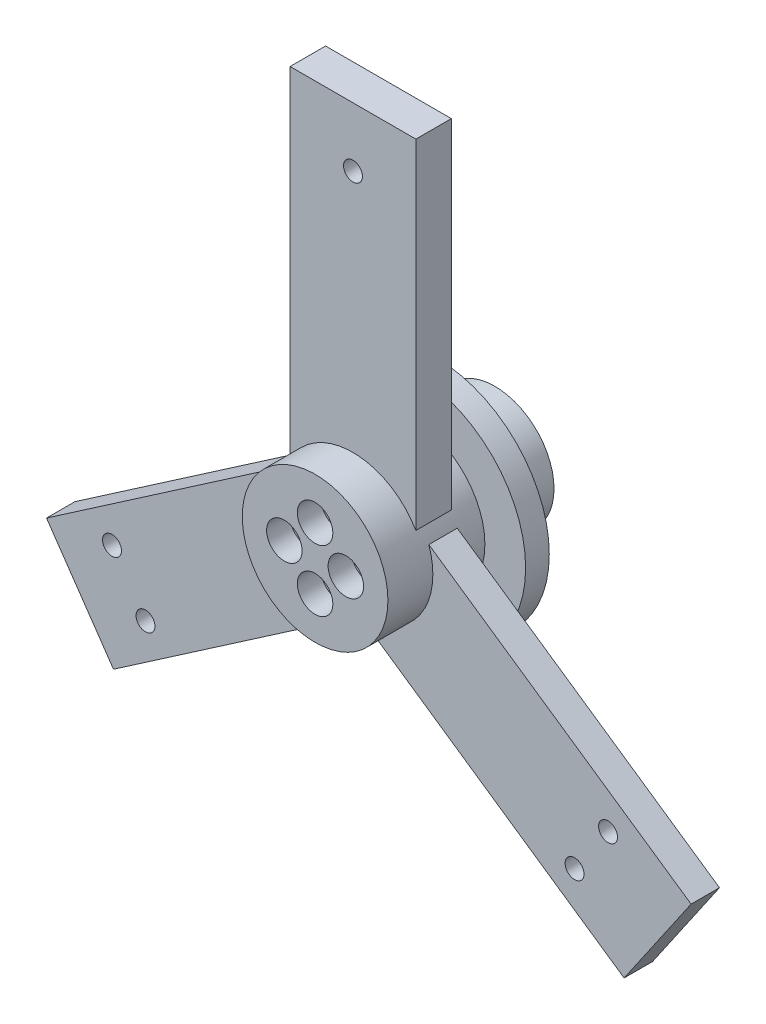
ISO-10303-21;
HEADER;
FILE_DESCRIPTION(('STEP AP214'),'2;1');
FILE_NAME('part.step','',(''),(''),'','','');
FILE_SCHEMA(('AUTOMOTIVE_DESIGN { 1 0 10303 214 1 1 1 1 }'));
ENDSEC;
DATA;
#1=APPLICATION_CONTEXT('core data for automotive mechanical design processes');
#2=APPLICATION_PROTOCOL_DEFINITION('international standard','automotive_design',2000,#1);
#3=PRODUCT_CONTEXT('',#1,'mechanical');
#4=PRODUCT('Part','Part','',(#3));
#5=PRODUCT_RELATED_PRODUCT_CATEGORY('part','',(#4));
#6=PRODUCT_DEFINITION_FORMATION('','',#4);
#7=PRODUCT_DEFINITION_CONTEXT('part definition',#1,'design');
#8=PRODUCT_DEFINITION('design','',#6,#7);
#9=PRODUCT_DEFINITION_SHAPE('','',#8);
#10=(LENGTH_UNIT() NAMED_UNIT(*) SI_UNIT(.MILLI.,.METRE.));
#11=(NAMED_UNIT(*) PLANE_ANGLE_UNIT() SI_UNIT($,.RADIAN.));
#12=(NAMED_UNIT(*) SI_UNIT($,.STERADIAN.) SOLID_ANGLE_UNIT());
#13=UNCERTAINTY_MEASURE_WITH_UNIT(LENGTH_MEASURE(1.E-05),#10,'distance_accuracy_value','');
#14=(GEOMETRIC_REPRESENTATION_CONTEXT(3) GLOBAL_UNCERTAINTY_ASSIGNED_CONTEXT((#13)) GLOBAL_UNIT_ASSIGNED_CONTEXT((#10,
#11,#12)) REPRESENTATION_CONTEXT('',''));
#15=CARTESIAN_POINT('',(0.,0.,0.));
#16=DIRECTION('',(0.,0.,1.));
#17=DIRECTION('',(1.,0.,0.));
#18=AXIS2_PLACEMENT_3D('',#15,#16,#17);
#19=CARTESIAN_POINT('',(0.,0.,25.));
#20=DIRECTION('',(0.,0.,-1.));
#21=DIRECTION('',(-1.,0.,0.));
#22=AXIS2_PLACEMENT_3D('',#19,#20,#21);
#23=CYLINDRICAL_SURFACE('',#22,25.);
#24=CARTESIAN_POINT('',(0.,0.,25.));
#25=DIRECTION('',(0.,0.,1.));
#26=DIRECTION('',(1.,0.,0.));
#27=AXIS2_PLACEMENT_3D('',#24,#25,#26);
#28=CIRCLE('',#27,25.);
#29=CARTESIAN_POINT('',(25.,0.,25.));
#30=VERTEX_POINT('',#29);
#31=EDGE_CURVE('E250',#30,#30,#28,.T.);
#32=ORIENTED_EDGE('',*,*,#31,.F.);
#33=EDGE_LOOP('',(#32));
#34=FACE_BOUND('',#33,.T.);
#35=CARTESIAN_POINT('',(0.,0.,0.));
#36=DIRECTION('',(0.,0.,1.));
#37=DIRECTION('',(1.,0.,0.));
#38=AXIS2_PLACEMENT_3D('',#35,#36,#37);
#39=CIRCLE('',#38,25.);
#40=CARTESIAN_POINT('',(25.,0.,0.));
#41=VERTEX_POINT('',#40);
#42=EDGE_CURVE('E255',#41,#41,#39,.T.);
#43=ORIENTED_EDGE('',*,*,#42,.T.);
#44=EDGE_LOOP('',(#43));
#45=FACE_BOUND('',#44,.T.);
#46=ADVANCED_FACE('F46',(#34,#45),#23,.T.);
#47=CARTESIAN_POINT('',(0.,0.,0.));
#48=DIRECTION('',(0.,0.,1.));
#49=DIRECTION('',(1.,0.,0.));
#50=AXIS2_PLACEMENT_3D('',#47,#48,#49);
#51=PLANE('',#50);
#52=CARTESIAN_POINT('',(0.,0.,0.));
#53=DIRECTION('',(0.,0.,-1.));
#54=DIRECTION('',(-1.,0.,0.));
#55=AXIS2_PLACEMENT_3D('',#52,#53,#54);
#56=CIRCLE('',#55,3.);
#57=CARTESIAN_POINT('',(-3.,0.,0.));
#58=VERTEX_POINT('',#57);
#59=EDGE_CURVE('E172',#58,#58,#56,.T.);
#60=ORIENTED_EDGE('',*,*,#59,.F.);
#61=EDGE_LOOP('',(#60));
#62=FACE_BOUND('',#61,.T.);
#63=ORIENTED_EDGE('',*,*,#42,.F.);
#64=EDGE_LOOP('',(#63));
#65=FACE_BOUND('',#64,.T.);
#66=ADVANCED_FACE('F324',(#62,#65),#51,.F.);
#67=CARTESIAN_POINT('',(0.,0.,35.));
#68=DIRECTION('',(0.,0.,-1.));
#69=DIRECTION('',(-1.,0.,0.));
#70=AXIS2_PLACEMENT_3D('',#67,#68,#69);
#71=CYLINDRICAL_SURFACE('',#70,48.);
#72=CARTESIAN_POINT('',(0.,0.,35.));
#73=DIRECTION('',(0.,0.,1.));
#74=DIRECTION('',(1.,0.,0.));
#75=AXIS2_PLACEMENT_3D('',#72,#73,#74);
#76=CIRCLE('',#75,48.);
#77=CARTESIAN_POINT('',(48.,0.,35.));
#78=VERTEX_POINT('',#77);
#79=EDGE_CURVE('E251',#78,#78,#76,.T.);
#80=ORIENTED_EDGE('',*,*,#79,.F.);
#81=EDGE_LOOP('',(#80));
#82=FACE_BOUND('',#81,.T.);
#83=CARTESIAN_POINT('',(0.,0.,25.));
#84=DIRECTION('',(0.,0.,1.));
#85=DIRECTION('',(1.,0.,0.));
#86=AXIS2_PLACEMENT_3D('',#83,#84,#85);
#87=CIRCLE('',#86,48.);
#88=CARTESIAN_POINT('',(48.,0.,25.));
#89=VERTEX_POINT('',#88);
#90=EDGE_CURVE('E244',#89,#89,#87,.T.);
#91=ORIENTED_EDGE('',*,*,#90,.T.);
#92=EDGE_LOOP('',(#91));
#93=FACE_BOUND('',#92,.T.);
#94=ADVANCED_FACE('F329',(#82,#93),#71,.T.);
#95=CARTESIAN_POINT('',(0.,0.,35.));
#96=DIRECTION('',(0.,0.,1.));
#97=DIRECTION('',(1.,0.,0.));
#98=AXIS2_PLACEMENT_3D('',#95,#96,#97);
#99=PLANE('',#98);
#100=CARTESIAN_POINT('',(0.,0.,35.));
#101=DIRECTION('',(0.,0.,1.));
#102=DIRECTION('',(1.,0.,0.));
#103=AXIS2_PLACEMENT_3D('',#100,#101,#102);
#104=CIRCLE('',#103,30.7857611899017);
#105=CARTESIAN_POINT('',(30.7857611899017,0.,35.));
#106=VERTEX_POINT('',#105);
#107=EDGE_CURVE('E245',#106,#106,#104,.T.);
#108=ORIENTED_EDGE('',*,*,#107,.F.);
#109=EDGE_LOOP('',(#108));
#110=FACE_BOUND('',#109,.T.);
#111=ORIENTED_EDGE('',*,*,#79,.T.);
#112=EDGE_LOOP('',(#111));
#113=FACE_BOUND('',#112,.T.);
#114=ADVANCED_FACE('F339',(#110,#113),#99,.T.);
#115=CARTESIAN_POINT('',(0.,0.,25.));
#116=DIRECTION('',(0.,0.,1.));
#117=DIRECTION('',(1.,0.,0.));
#118=AXIS2_PLACEMENT_3D('',#115,#116,#117);
#119=PLANE('',#118);
#120=ORIENTED_EDGE('',*,*,#31,.T.);
#121=EDGE_LOOP('',(#120));
#122=FACE_BOUND('',#121,.T.);
#123=ORIENTED_EDGE('',*,*,#90,.F.);
#124=EDGE_LOOP('',(#123));
#125=FACE_BOUND('',#124,.T.);
#126=ADVANCED_FACE('F336',(#122,#125),#119,.F.);
#127=CARTESIAN_POINT('',(0.,0.,76.));
#128=DIRECTION('',(0.,0.,-1.));
#129=DIRECTION('',(-1.,0.,0.));
#130=AXIS2_PLACEMENT_3D('',#127,#128,#129);
#131=CYLINDRICAL_SURFACE('',#130,30.7857611899017);
#132=CARTESIAN_POINT('',(0.,0.,60.));
#133=DIRECTION('',(0.,0.,1.));
#134=DIRECTION('',(1.,0.,0.));
#135=AXIS2_PLACEMENT_3D('',#132,#133,#134);
#136=CIRCLE('',#135,30.7857611899017);
#137=CARTESIAN_POINT('',(26.5992266569271,15.4998139761442,60.));
#138=VERTEX_POINT('',#137);
#139=CARTESIAN_POINT('',(-26.5600718974859,15.5668131883837,60.));
#140=VERTEX_POINT('',#139);
#141=EDGE_CURVE('E296',#138,#140,#136,.T.);
#142=ORIENTED_EDGE('',*,*,#141,.T.);
#143=DIRECTION('',(0.,0.,-1.));
#144=VECTOR('',#143,1.);
#145=CARTESIAN_POINT('',(-26.5600718974859,15.5668131883837,76.));
#146=LINE('',#145,#144);
#147=CARTESIAN_POINT('',(-26.5600718974859,15.5668131883837,45.));
#148=VERTEX_POINT('',#147);
#149=EDGE_CURVE('E11',#140,#148,#146,.T.);
#150=ORIENTED_EDGE('',*,*,#149,.T.);
#151=CARTESIAN_POINT('',(0.,0.,45.));
#152=DIRECTION('',(0.,0.,-1.));
#153=DIRECTION('',(-1.,0.,0.));
#154=AXIS2_PLACEMENT_3D('',#151,#152,#153);
#155=CIRCLE('',#154,30.7857611899017);
#156=CARTESIAN_POINT('',(26.5992266569271,15.4998139761442,45.));
#157=VERTEX_POINT('',#156);
#158=EDGE_CURVE('E54',#148,#157,#155,.T.);
#159=ORIENTED_EDGE('',*,*,#158,.T.);
#160=DIRECTION('',(0.,0.,-1.));
#161=VECTOR('',#160,1.);
#162=CARTESIAN_POINT('',(26.5992266569271,15.4998139761442,76.));
#163=LINE('',#162,#161);
#164=EDGE_CURVE('E299',#157,#138,#163,.F.);
#165=ORIENTED_EDGE('',*,*,#164,.T.);
#166=EDGE_LOOP('',(#142,#150,#159,#165));
#167=FACE_BOUND('',#166,.T.);
#168=DIRECTION('',(0.,0.,-1.));
#169=VECTOR('',#168,1.);
#170=CARTESIAN_POINT('',(29.0873885522905,10.0839932194413,76.));
#171=LINE('',#170,#169);
#172=CARTESIAN_POINT('',(29.0873885522905,10.0839932194413,57.));
#173=VERTEX_POINT('',#172);
#174=CARTESIAN_POINT('',(29.0873885522905,10.0839932194413,45.));
#175=VERTEX_POINT('',#174);
#176=EDGE_CURVE('E280',#173,#175,#171,.T.);
#177=ORIENTED_EDGE('',*,*,#176,.T.);
#178=CARTESIAN_POINT('',(0.,0.,45.));
#179=DIRECTION('',(0.,0.,-1.));
#180=DIRECTION('',(0.,1.,0.));
#181=AXIS2_PLACEMENT_3D('',#178,#179,#180);
#182=CIRCLE('',#181,30.7857611899017);
#183=CARTESIAN_POINT('',(0.275591272082924,-30.7845276314646,45.));
#184=VERTEX_POINT('',#183);
#185=EDGE_CURVE('E292',#175,#184,#182,.T.);
#186=ORIENTED_EDGE('',*,*,#185,.T.);
#187=DIRECTION('',(0.,0.,-1.));
#188=VECTOR('',#187,1.);
#189=CARTESIAN_POINT('',(0.275591272082926,-30.7845276314646,76.));
#190=LINE('',#189,#188);
#191=CARTESIAN_POINT('',(0.275591272082923,-30.7845276314646,57.));
#192=VERTEX_POINT('',#191);
#193=EDGE_CURVE('E288',#184,#192,#190,.F.);
#194=ORIENTED_EDGE('',*,*,#193,.T.);
#195=CARTESIAN_POINT('',(0.,0.,57.));
#196=DIRECTION('',(0.,0.,1.));
#197=DIRECTION('',(0.,-1.,0.));
#198=AXIS2_PLACEMENT_3D('',#195,#196,#197);
#199=CIRCLE('',#198,30.7857611899017);
#200=EDGE_CURVE('E284',#192,#173,#199,.T.);
#201=ORIENTED_EDGE('',*,*,#200,.T.);
#202=EDGE_LOOP('',(#177,#186,#194,#201));
#203=FACE_BOUND('',#202,.T.);
#204=DIRECTION('',(0.,0.,-1.));
#205=VECTOR('',#204,1.);
#206=CARTESIAN_POINT('',(-0.275591272082912,-30.7845276314646,76.));
#207=LINE('',#206,#205);
#208=CARTESIAN_POINT('',(-0.27559127208291,-30.7845276314646,57.));
#209=VERTEX_POINT('',#208);
#210=CARTESIAN_POINT('',(-0.275591272082912,-30.7845276314646,45.));
#211=VERTEX_POINT('',#210);
#212=EDGE_CURVE('E249',#209,#211,#207,.T.);
#213=ORIENTED_EDGE('',*,*,#212,.T.);
#214=CARTESIAN_POINT('',(0.,0.,45.));
#215=DIRECTION('',(0.,0.,-1.));
#216=DIRECTION('',(0.,1.,0.));
#217=AXIS2_PLACEMENT_3D('',#214,#215,#216);
#218=CIRCLE('',#217,30.7857611899017);
#219=CARTESIAN_POINT('',(-29.0873885522905,10.0839932194413,45.));
#220=VERTEX_POINT('',#219);
#221=EDGE_CURVE('E276',#211,#220,#218,.T.);
#222=ORIENTED_EDGE('',*,*,#221,.T.);
#223=DIRECTION('',(0.,0.,-1.));
#224=VECTOR('',#223,1.);
#225=CARTESIAN_POINT('',(-29.0873885522905,10.0839932194413,76.));
#226=LINE('',#225,#224);
#227=CARTESIAN_POINT('',(-29.0873885522905,10.0839932194413,57.));
#228=VERTEX_POINT('',#227);
#229=EDGE_CURVE('E272',#220,#228,#226,.F.);
#230=ORIENTED_EDGE('',*,*,#229,.T.);
#231=CARTESIAN_POINT('',(0.,0.,57.));
#232=DIRECTION('',(0.,0.,1.));
#233=DIRECTION('',(1.,0.,0.));
#234=AXIS2_PLACEMENT_3D('',#231,#232,#233);
#235=CIRCLE('',#234,30.7857611899017);
#236=EDGE_CURVE('E268',#228,#209,#235,.T.);
#237=ORIENTED_EDGE('',*,*,#236,.T.);
#238=EDGE_LOOP('',(#213,#222,#230,#237));
#239=FACE_BOUND('',#238,.T.);
#240=CARTESIAN_POINT('',(0.,0.,76.));
#241=DIRECTION('',(0.,0.,1.));
#242=DIRECTION('',(1.,0.,0.));
#243=AXIS2_PLACEMENT_3D('',#240,#241,#242);
#244=CIRCLE('',#243,30.7857611899017);
#245=CARTESIAN_POINT('',(30.7857611899017,0.,76.));
#246=VERTEX_POINT('',#245);
#247=EDGE_CURVE('E232',#246,#246,#244,.T.);
#248=ORIENTED_EDGE('',*,*,#247,.F.);
#249=EDGE_LOOP('',(#248));
#250=FACE_BOUND('',#249,.T.);
#251=ORIENTED_EDGE('',*,*,#107,.T.);
#252=EDGE_LOOP('',(#251));
#253=FACE_BOUND('',#252,.T.);
#254=ADVANCED_FACE('F305',(#167,#203,#239,#250,#253),#131,.T.);
#255=CARTESIAN_POINT('',(0.,0.,76.));
#256=DIRECTION('',(0.,0.,1.));
#257=DIRECTION('',(1.,0.,0.));
#258=AXIS2_PLACEMENT_3D('',#255,#256,#257);
#259=PLANE('',#258);
#260=CARTESIAN_POINT('',(0.,13.,76.));
#261=DIRECTION('',(0.,0.,1.));
#262=DIRECTION('',(1.,0.,0.));
#263=AXIS2_PLACEMENT_3D('',#260,#261,#262);
#264=CIRCLE('',#263,7.5);
#265=CARTESIAN_POINT('',(7.5,13.,76.));
#266=VERTEX_POINT('',#265);
#267=EDGE_CURVE('E463',#266,#266,#264,.T.);
#268=ORIENTED_EDGE('',*,*,#267,.F.);
#269=EDGE_LOOP('',(#268));
#270=FACE_BOUND('',#269,.T.);
#271=CARTESIAN_POINT('',(13.,0.,76.));
#272=DIRECTION('',(0.,0.,1.));
#273=DIRECTION('',(1.,0.,0.));
#274=AXIS2_PLACEMENT_3D('',#271,#272,#273);
#275=CIRCLE('',#274,7.5);
#276=CARTESIAN_POINT('',(20.5,0.,76.));
#277=VERTEX_POINT('',#276);
#278=EDGE_CURVE('E471',#277,#277,#275,.T.);
#279=ORIENTED_EDGE('',*,*,#278,.F.);
#280=EDGE_LOOP('',(#279));
#281=FACE_BOUND('',#280,.T.);
#282=CARTESIAN_POINT('',(0.,-13.,76.));
#283=DIRECTION('',(0.,0.,1.));
#284=DIRECTION('',(1.,0.,0.));
#285=AXIS2_PLACEMENT_3D('',#282,#283,#284);
#286=CIRCLE('',#285,7.5);
#287=CARTESIAN_POINT('',(7.5,-13.,76.));
#288=VERTEX_POINT('',#287);
#289=EDGE_CURVE('E455',#288,#288,#286,.T.);
#290=ORIENTED_EDGE('',*,*,#289,.F.);
#291=EDGE_LOOP('',(#290));
#292=FACE_BOUND('',#291,.T.);
#293=CARTESIAN_POINT('',(-13.,0.,76.));
#294=DIRECTION('',(0.,0.,1.));
#295=DIRECTION('',(1.,0.,0.));
#296=AXIS2_PLACEMENT_3D('',#293,#294,#295);
#297=CIRCLE('',#296,7.5);
#298=CARTESIAN_POINT('',(-5.5,0.,76.));
#299=VERTEX_POINT('',#298);
#300=EDGE_CURVE('E161',#299,#299,#297,.T.);
#301=ORIENTED_EDGE('',*,*,#300,.F.);
#302=EDGE_LOOP('',(#301));
#303=FACE_BOUND('',#302,.T.);
#304=ORIENTED_EDGE('',*,*,#247,.T.);
#305=EDGE_LOOP('',(#304));
#306=FACE_BOUND('',#305,.T.);
#307=ADVANCED_FACE('F355',(#270,#281,#292,#303,#306),#259,.T.);
#308=CARTESIAN_POINT('',(-13.8622499108685,20.5479410997602,45.));
#309=DIRECTION('',(-0.566406236924831,0.824126188622017,0.));
#310=DIRECTION('',(-0.824126188622017,-0.566406236924831,0.));
#311=AXIS2_PLACEMENT_3D('',#308,#309,#310);
#312=PLANE('',#311);
#313=ORIENTED_EDGE('',*,*,#229,.F.);
#314=DIRECTION('',(-0.824126188622017,-0.566406236924831,0.));
#315=VECTOR('',#314,1.);
#316=CARTESIAN_POINT('',(-13.8622499108685,20.5479410997602,45.));
#317=LINE('',#316,#315);
#318=CARTESIAN_POINT('',(-132.536421072439,-61.0145570174155,45.));
#319=VERTEX_POINT('',#318);
#320=EDGE_CURVE('E229',#220,#319,#317,.T.);
#321=ORIENTED_EDGE('',*,*,#320,.T.);
#322=DIRECTION('',(0.,0.,-1.));
#323=VECTOR('',#322,1.);
#324=CARTESIAN_POINT('',(-132.536421072439,-61.0145570174155,45.));
#325=LINE('',#324,#323);
#326=CARTESIAN_POINT('',(-132.536421072439,-61.0145570174155,57.));
#327=VERTEX_POINT('',#326);
#328=EDGE_CURVE('E224',#327,#319,#325,.T.);
#329=ORIENTED_EDGE('',*,*,#328,.F.);
#330=DIRECTION('',(-0.824126188622017,-0.566406236924831,0.));
#331=VECTOR('',#330,1.);
#332=CARTESIAN_POINT('',(-13.8622499108685,20.5479410997602,57.));
#333=LINE('',#332,#331);
#334=EDGE_CURVE('E233',#228,#327,#333,.T.);
#335=ORIENTED_EDGE('',*,*,#334,.F.);
#336=EDGE_LOOP('',(#313,#321,#329,#335));
#337=FACE_BOUND('',#336,.T.);
#338=ADVANCED_FACE('F358',(#337),#312,.T.);
#339=CARTESIAN_POINT('',(14.458061935373,-20.6583683313406,45.));
#340=DIRECTION('',(0.566406236924831,-0.824126188622017,0.));
#341=DIRECTION('',(0.824126188622017,0.566406236924831,0.));
#342=AXIS2_PLACEMENT_3D('',#339,#340,#341);
#343=PLANE('',#342);
#344=ORIENTED_EDGE('',*,*,#212,.F.);
#345=DIRECTION('',(-0.824126188622017,-0.566406236924831,0.));
#346=VECTOR('',#345,1.);
#347=CARTESIAN_POINT('',(14.458061935373,-20.6583683313406,57.));
#348=LINE('',#347,#346);
#349=CARTESIAN_POINT('',(-104.216109226197,-102.220866448516,57.));
#350=VERTEX_POINT('',#349);
#351=EDGE_CURVE('E236',#209,#350,#348,.T.);
#352=ORIENTED_EDGE('',*,*,#351,.T.);
#353=DIRECTION('',(0.,0.,1.));
#354=VECTOR('',#353,1.);
#355=CARTESIAN_POINT('',(-104.216109226197,-102.220866448516,45.));
#356=LINE('',#355,#354);
#357=CARTESIAN_POINT('',(-104.216109226197,-102.220866448516,45.));
#358=VERTEX_POINT('',#357);
#359=EDGE_CURVE('E216',#358,#350,#356,.T.);
#360=ORIENTED_EDGE('',*,*,#359,.F.);
#361=DIRECTION('',(-0.824126188622017,-0.566406236924831,0.));
#362=VECTOR('',#361,1.);
#363=CARTESIAN_POINT('',(14.458061935373,-20.6583683313406,45.));
#364=LINE('',#363,#362);
#365=EDGE_CURVE('E228',#211,#358,#364,.T.);
#366=ORIENTED_EDGE('',*,*,#365,.F.);
#367=EDGE_LOOP('',(#344,#352,#360,#366));
#368=FACE_BOUND('',#367,.T.);
#369=ADVANCED_FACE('F364',(#368),#343,.T.);
#370=CARTESIAN_POINT('',(-13.8622499108685,20.5479410997602,45.));
#371=DIRECTION('',(0.,0.,-1.));
#372=DIRECTION('',(0.,1.,0.));
#373=AXIS2_PLACEMENT_3D('',#370,#371,#372);
#374=PLANE('',#373);
#375=CARTESIAN_POINT('',(-104.853188395328,-57.1559784520699,45.));
#376=DIRECTION('',(0.,0.,-1.));
#377=DIRECTION('',(0.,1.,0.));
#378=AXIS2_PLACEMENT_3D('',#375,#376,#377);
#379=CIRCLE('',#378,4.00000000000001);
#380=CARTESIAN_POINT('',(-104.853188395328,-53.1559784520699,45.));
#381=VERTEX_POINT('',#380);
#382=EDGE_CURVE('E450',#381,#381,#379,.T.);
#383=ORIENTED_EDGE('',*,*,#382,.F.);
#384=EDGE_LOOP('',(#383));
#385=FACE_BOUND('',#384,.T.);
#386=CARTESIAN_POINT('',(-90.6930324722074,-77.7591331676203,45.));
#387=DIRECTION('',(0.,0.,-1.));
#388=DIRECTION('',(0.,1.,0.));
#389=AXIS2_PLACEMENT_3D('',#386,#387,#388);
#390=CIRCLE('',#389,4.00000000000001);
#391=CARTESIAN_POINT('',(-90.6930324722074,-73.7591331676203,45.));
#392=VERTEX_POINT('',#391);
#393=EDGE_CURVE('E443',#392,#392,#390,.T.);
#394=ORIENTED_EDGE('',*,*,#393,.F.);
#395=EDGE_LOOP('',(#394));
#396=FACE_BOUND('',#395,.T.);
#397=ORIENTED_EDGE('',*,*,#221,.F.);
#398=ORIENTED_EDGE('',*,*,#365,.T.);
#399=DIRECTION('',(0.566406236924831,-0.824126188622017,0.));
#400=VECTOR('',#399,1.);
#401=CARTESIAN_POINT('',(-132.536421072439,-61.0145570174155,45.));
#402=LINE('',#401,#400);
#403=EDGE_CURVE('E204',#319,#358,#402,.T.);
#404=ORIENTED_EDGE('',*,*,#403,.F.);
#405=ORIENTED_EDGE('',*,*,#320,.F.);
#406=EDGE_LOOP('',(#397,#398,#404,#405));
#407=FACE_BOUND('',#406,.T.);
#408=ADVANCED_FACE('F360',(#385,#396,#407),#374,.T.);
#409=CARTESIAN_POINT('',(-13.8622499108685,20.5479410997602,57.));
#410=DIRECTION('',(0.,0.,1.));
#411=DIRECTION('',(1.,0.,0.));
#412=AXIS2_PLACEMENT_3D('',#409,#410,#411);
#413=PLANE('',#412);
#414=CARTESIAN_POINT('',(-104.853188395328,-57.1559784520699,57.));
#415=DIRECTION('',(0.,0.,1.));
#416=DIRECTION('',(1.,0.,0.));
#417=AXIS2_PLACEMENT_3D('',#414,#415,#416);
#418=CIRCLE('',#417,4.00000000000001);
#419=CARTESIAN_POINT('',(-100.853188395328,-57.1559784520699,57.));
#420=VERTEX_POINT('',#419);
#421=EDGE_CURVE('E439',#420,#420,#418,.T.);
#422=ORIENTED_EDGE('',*,*,#421,.F.);
#423=EDGE_LOOP('',(#422));
#424=FACE_BOUND('',#423,.T.);
#425=CARTESIAN_POINT('',(-90.6930324722074,-77.7591331676203,57.));
#426=DIRECTION('',(0.,0.,1.));
#427=DIRECTION('',(1.,0.,0.));
#428=AXIS2_PLACEMENT_3D('',#425,#426,#427);
#429=CIRCLE('',#428,4.00000000000001);
#430=CARTESIAN_POINT('',(-86.6930324722074,-77.7591331676203,57.));
#431=VERTEX_POINT('',#430);
#432=EDGE_CURVE('E438',#431,#431,#429,.T.);
#433=ORIENTED_EDGE('',*,*,#432,.F.);
#434=EDGE_LOOP('',(#433));
#435=FACE_BOUND('',#434,.T.);
#436=ORIENTED_EDGE('',*,*,#236,.F.);
#437=ORIENTED_EDGE('',*,*,#334,.T.);
#438=DIRECTION('',(-0.566406236924831,0.824126188622017,0.));
#439=VECTOR('',#438,1.);
#440=CARTESIAN_POINT('',(-132.536421072439,-61.0145570174155,57.));
#441=LINE('',#440,#439);
#442=EDGE_CURVE('E220',#350,#327,#441,.T.);
#443=ORIENTED_EDGE('',*,*,#442,.F.);
#444=ORIENTED_EDGE('',*,*,#351,.F.);
#445=EDGE_LOOP('',(#436,#437,#443,#444));
#446=FACE_BOUND('',#445,.T.);
#447=ADVANCED_FACE('F363',(#424,#435,#446),#413,.T.);
#448=CARTESIAN_POINT('',(-118.497611347549,-81.4411519189447,0.));
#449=DIRECTION('',(-0.824126188622017,-0.566406236924831,0.));
#450=DIRECTION('',(0.566406236924831,-0.824126188622017,0.));
#451=AXIS2_PLACEMENT_3D('',#448,#449,#450);
#452=PLANE('',#451);
#453=ORIENTED_EDGE('',*,*,#403,.T.);
#454=ORIENTED_EDGE('',*,*,#359,.T.);
#455=ORIENTED_EDGE('',*,*,#442,.T.);
#456=ORIENTED_EDGE('',*,*,#328,.T.);
#457=EDGE_LOOP('',(#453,#454,#455,#456));
#458=FACE_BOUND('',#457,.T.);
#459=ADVANCED_FACE('F371',(#458),#452,.T.);
#460=CARTESIAN_POINT('',(-6.21680004915285,-26.3224307005889,45.));
#461=DIRECTION('',(-0.566406236924831,-0.824126188622017,0.));
#462=DIRECTION('',(0.824126188622017,-0.566406236924831,0.));
#463=AXIS2_PLACEMENT_3D('',#460,#461,#462);
#464=PLANE('',#463);
#465=ORIENTED_EDGE('',*,*,#193,.F.);
#466=DIRECTION('',(0.824126188622017,-0.566406236924831,0.));
#467=VECTOR('',#466,1.);
#468=CARTESIAN_POINT('',(-6.21680004915285,-26.3224307005889,45.));
#469=LINE('',#468,#467);
#470=CARTESIAN_POINT('',(111.633244923796,-107.31852258084,45.));
#471=VERTEX_POINT('',#470);
#472=EDGE_CURVE('E201',#184,#471,#469,.T.);
#473=ORIENTED_EDGE('',*,*,#472,.T.);
#474=DIRECTION('',(0.,0.,-1.));
#475=VECTOR('',#474,1.);
#476=CARTESIAN_POINT('',(111.633244923796,-107.31852258084,45.));
#477=LINE('',#476,#475);
#478=CARTESIAN_POINT('',(111.633244923796,-107.31852258084,57.));
#479=VERTEX_POINT('',#478);
#480=EDGE_CURVE('E197',#479,#471,#477,.T.);
#481=ORIENTED_EDGE('',*,*,#480,.F.);
#482=DIRECTION('',(0.824126188622017,-0.566406236924831,0.));
#483=VECTOR('',#482,1.);
#484=CARTESIAN_POINT('',(-6.21680004915285,-26.3224307005889,57.));
#485=LINE('',#484,#483);
#486=EDGE_CURVE('E205',#192,#479,#485,.T.);
#487=ORIENTED_EDGE('',*,*,#486,.F.);
#488=EDGE_LOOP('',(#465,#473,#481,#487));
#489=FACE_BOUND('',#488,.T.);
#490=ADVANCED_FACE('F378',(#489),#464,.T.);
#491=CARTESIAN_POINT('',(22.1035117970887,14.8838787305119,45.));
#492=DIRECTION('',(0.566406236924831,0.824126188622017,0.));
#493=DIRECTION('',(-0.824126188622017,0.566406236924831,0.));
#494=AXIS2_PLACEMENT_3D('',#491,#492,#493);
#495=PLANE('',#494);
#496=ORIENTED_EDGE('',*,*,#176,.F.);
#497=DIRECTION('',(0.824126188622017,-0.566406236924831,0.));
#498=VECTOR('',#497,1.);
#499=CARTESIAN_POINT('',(22.1035117970887,14.8838787305119,57.));
#500=LINE('',#499,#498);
#501=CARTESIAN_POINT('',(139.953556770037,-66.112213149739,57.));
#502=VERTEX_POINT('',#501);
#503=EDGE_CURVE('E208',#173,#502,#500,.T.);
#504=ORIENTED_EDGE('',*,*,#503,.T.);
#505=DIRECTION('',(0.,0.,1.));
#506=VECTOR('',#505,1.);
#507=CARTESIAN_POINT('',(139.953556770037,-66.112213149739,45.));
#508=LINE('',#507,#506);
#509=CARTESIAN_POINT('',(139.953556770037,-66.112213149739,45.));
#510=VERTEX_POINT('',#509);
#511=EDGE_CURVE('E189',#510,#502,#508,.T.);
#512=ORIENTED_EDGE('',*,*,#511,.F.);
#513=DIRECTION('',(0.824126188622017,-0.566406236924831,0.));
#514=VECTOR('',#513,1.);
#515=CARTESIAN_POINT('',(22.1035117970887,14.8838787305119,45.));
#516=LINE('',#515,#514);
#517=EDGE_CURVE('E69',#175,#510,#516,.T.);
#518=ORIENTED_EDGE('',*,*,#517,.F.);
#519=EDGE_LOOP('',(#496,#504,#512,#518));
#520=FACE_BOUND('',#519,.T.);
#521=ADVANCED_FACE('F384',(#520),#495,.T.);
#522=CARTESIAN_POINT('',(22.1035117970887,14.8838787305119,45.));
#523=DIRECTION('',(0.,0.,-1.));
#524=DIRECTION('',(0.,1.,0.));
#525=AXIS2_PLACEMENT_3D('',#522,#523,#524);
#526=PLANE('',#525);
#527=CARTESIAN_POINT('',(104.853188395328,-57.1559784520699,45.));
#528=DIRECTION('',(0.,0.,-1.));
#529=DIRECTION('',(0.,1.,0.));
#530=AXIS2_PLACEMENT_3D('',#527,#528,#529);
#531=CIRCLE('',#530,4.00000000000001);
#532=CARTESIAN_POINT('',(104.853188395328,-53.1559784520699,45.));
#533=VERTEX_POINT('',#532);
#534=EDGE_CURVE('E434',#533,#533,#531,.F.);
#535=ORIENTED_EDGE('',*,*,#534,.T.);
#536=EDGE_LOOP('',(#535));
#537=FACE_BOUND('',#536,.T.);
#538=CARTESIAN_POINT('',(90.6930324722074,-77.7591331676203,45.));
#539=DIRECTION('',(0.,0.,-1.));
#540=DIRECTION('',(0.,1.,0.));
#541=AXIS2_PLACEMENT_3D('',#538,#539,#540);
#542=CIRCLE('',#541,4.00000000000001);
#543=CARTESIAN_POINT('',(90.6930324722074,-73.7591331676203,45.));
#544=VERTEX_POINT('',#543);
#545=EDGE_CURVE('E427',#544,#544,#542,.F.);
#546=ORIENTED_EDGE('',*,*,#545,.T.);
#547=EDGE_LOOP('',(#546));
#548=FACE_BOUND('',#547,.T.);
#549=ORIENTED_EDGE('',*,*,#185,.F.);
#550=ORIENTED_EDGE('',*,*,#517,.T.);
#551=DIRECTION('',(0.566406236924831,0.824126188622017,0.));
#552=VECTOR('',#551,1.);
#553=CARTESIAN_POINT('',(139.953556770037,-66.112213149739,45.));
#554=LINE('',#553,#552);
#555=EDGE_CURVE('E182',#471,#510,#554,.T.);
#556=ORIENTED_EDGE('',*,*,#555,.F.);
#557=ORIENTED_EDGE('',*,*,#472,.F.);
#558=EDGE_LOOP('',(#549,#550,#556,#557));
#559=FACE_BOUND('',#558,.T.);
#560=ADVANCED_FACE('F380',(#537,#548,#559),#526,.T.);
#561=CARTESIAN_POINT('',(22.1035117970887,14.8838787305119,57.));
#562=DIRECTION('',(0.,0.,1.));
#563=DIRECTION('',(0.,-1.,0.));
#564=AXIS2_PLACEMENT_3D('',#561,#562,#563);
#565=PLANE('',#564);
#566=CARTESIAN_POINT('',(104.853188395328,-57.1559784520699,57.));
#567=DIRECTION('',(0.,0.,-1.));
#568=DIRECTION('',(-1.,0.,0.));
#569=AXIS2_PLACEMENT_3D('',#566,#567,#568);
#570=CIRCLE('',#569,4.00000000000001);
#571=CARTESIAN_POINT('',(100.853188395328,-57.1559784520699,57.));
#572=VERTEX_POINT('',#571);
#573=EDGE_CURVE('E423',#572,#572,#570,.T.);
#574=ORIENTED_EDGE('',*,*,#573,.T.);
#575=EDGE_LOOP('',(#574));
#576=FACE_BOUND('',#575,.T.);
#577=CARTESIAN_POINT('',(90.6930324722074,-77.7591331676203,57.));
#578=DIRECTION('',(0.,0.,-1.));
#579=DIRECTION('',(-1.,0.,0.));
#580=AXIS2_PLACEMENT_3D('',#577,#578,#579);
#581=CIRCLE('',#580,4.00000000000001);
#582=CARTESIAN_POINT('',(86.6930324722074,-77.7591331676203,57.));
#583=VERTEX_POINT('',#582);
#584=EDGE_CURVE('E420',#583,#583,#581,.T.);
#585=ORIENTED_EDGE('',*,*,#584,.T.);
#586=EDGE_LOOP('',(#585));
#587=FACE_BOUND('',#586,.T.);
#588=ORIENTED_EDGE('',*,*,#200,.F.);
#589=ORIENTED_EDGE('',*,*,#486,.T.);
#590=DIRECTION('',(-0.566406236924831,-0.824126188622017,0.));
#591=VECTOR('',#590,1.);
#592=CARTESIAN_POINT('',(139.953556770037,-66.112213149739,57.));
#593=LINE('',#592,#591);
#594=EDGE_CURVE('E193',#502,#479,#593,.T.);
#595=ORIENTED_EDGE('',*,*,#594,.F.);
#596=ORIENTED_EDGE('',*,*,#503,.F.);
#597=EDGE_LOOP('',(#588,#589,#595,#596));
#598=FACE_BOUND('',#597,.T.);
#599=ADVANCED_FACE('F383',(#576,#587,#598),#565,.T.);
#600=CARTESIAN_POINT('',(125.914747045147,-86.5388080512682,0.));
#601=DIRECTION('',(-0.824126188622017,0.566406236924831,0.));
#602=DIRECTION('',(-0.566406236924831,-0.824126188622017,0.));
#603=AXIS2_PLACEMENT_3D('',#600,#601,#602);
#604=PLANE('',#603);
#605=ORIENTED_EDGE('',*,*,#555,.T.);
#606=ORIENTED_EDGE('',*,*,#511,.T.);
#607=ORIENTED_EDGE('',*,*,#594,.T.);
#608=ORIENTED_EDGE('',*,*,#480,.T.);
#609=EDGE_LOOP('',(#605,#606,#607,#608));
#610=FACE_BOUND('',#609,.T.);
#611=ADVANCED_FACE('F390',(#610),#604,.F.);
#612=CARTESIAN_POINT('',(0.,0.,25.));
#613=DIRECTION('',(0.,0.,-1.));
#614=DIRECTION('',(-1.,0.,0.));
#615=AXIS2_PLACEMENT_3D('',#612,#613,#614);
#616=CYLINDRICAL_SURFACE('',#615,3.);
#617=CARTESIAN_POINT('',(0.,0.,25.));
#618=DIRECTION('',(0.,0.,-1.));
#619=DIRECTION('',(-1.,0.,0.));
#620=AXIS2_PLACEMENT_3D('',#617,#618,#619);
#621=CIRCLE('',#620,3.);
#622=CARTESIAN_POINT('',(-3.,0.,25.));
#623=VERTEX_POINT('',#622);
#624=EDGE_CURVE('E178',#623,#623,#621,.T.);
#625=ORIENTED_EDGE('',*,*,#624,.F.);
#626=EDGE_LOOP('',(#625));
#627=FACE_BOUND('',#626,.T.);
#628=ORIENTED_EDGE('',*,*,#59,.T.);
#629=EDGE_LOOP('',(#628));
#630=FACE_BOUND('',#629,.T.);
#631=ADVANCED_FACE('F397',(#627,#630),#616,.F.);
#632=CARTESIAN_POINT('',(0.,0.,25.));
#633=DIRECTION('',(0.,0.,-1.));
#634=DIRECTION('',(-1.,0.,0.));
#635=AXIS2_PLACEMENT_3D('',#632,#633,#634);
#636=PLANE('',#635);
#637=ORIENTED_EDGE('',*,*,#624,.T.);
#638=EDGE_LOOP('',(#637));
#639=FACE_BOUND('',#638,.T.);
#640=ADVANCED_FACE('F320',(#639),#636,.T.);
#641=CARTESIAN_POINT('',(-26.5600718974859,14.7857611899017,45.));
#642=DIRECTION('',(-1.,0.,0.));
#643=DIRECTION('',(0.,0.,1.));
#644=AXIS2_PLACEMENT_3D('',#641,#642,#643);
#645=PLANE('',#644);
#646=ORIENTED_EDGE('',*,*,#149,.F.);
#647=DIRECTION('',(0.,1.,0.));
#648=VECTOR('',#647,1.);
#649=CARTESIAN_POINT('',(-26.5600718974859,14.7857611899017,60.));
#650=LINE('',#649,#648);
#651=CARTESIAN_POINT('',(-26.5600718974859,158.785761189902,60.));
#652=VERTEX_POINT('',#651);
#653=EDGE_CURVE('E61',#140,#652,#650,.T.);
#654=ORIENTED_EDGE('',*,*,#653,.T.);
#655=DIRECTION('',(0.,0.,1.));
#656=VECTOR('',#655,1.);
#657=CARTESIAN_POINT('',(-26.5600718974859,158.785761189902,45.));
#658=LINE('',#657,#656);
#659=CARTESIAN_POINT('',(-26.5600718974859,158.785761189902,45.));
#660=VERTEX_POINT('',#659);
#661=EDGE_CURVE('E137',#660,#652,#658,.T.);
#662=ORIENTED_EDGE('',*,*,#661,.F.);
#663=DIRECTION('',(0.,1.,0.));
#664=VECTOR('',#663,1.);
#665=CARTESIAN_POINT('',(-26.5600718974859,14.7857611899017,45.));
#666=LINE('',#665,#664);
#667=EDGE_CURVE('E169',#148,#660,#666,.T.);
#668=ORIENTED_EDGE('',*,*,#667,.F.);
#669=EDGE_LOOP('',(#646,#654,#662,#668));
#670=FACE_BOUND('',#669,.T.);
#671=ADVANCED_FACE('F134',(#670),#645,.T.);
#672=CARTESIAN_POINT('',(26.5992266569271,14.7857611899017,45.));
#673=DIRECTION('',(1.,0.,0.));
#674=DIRECTION('',(0.,0.,-1.));
#675=AXIS2_PLACEMENT_3D('',#672,#673,#674);
#676=PLANE('',#675);
#677=ORIENTED_EDGE('',*,*,#164,.F.);
#678=DIRECTION('',(0.,1.,0.));
#679=VECTOR('',#678,1.);
#680=CARTESIAN_POINT('',(26.5992266569271,14.7857611899017,45.));
#681=LINE('',#680,#679);
#682=CARTESIAN_POINT('',(26.5992266569271,158.785761189902,45.));
#683=VERTEX_POINT('',#682);
#684=EDGE_CURVE('E173',#157,#683,#681,.T.);
#685=ORIENTED_EDGE('',*,*,#684,.T.);
#686=DIRECTION('',(0.,0.,-1.));
#687=VECTOR('',#686,1.);
#688=CARTESIAN_POINT('',(26.5992266569271,158.785761189902,45.));
#689=LINE('',#688,#687);
#690=CARTESIAN_POINT('',(26.5992266569271,158.785761189902,60.));
#691=VERTEX_POINT('',#690);
#692=EDGE_CURVE('E151',#691,#683,#689,.T.);
#693=ORIENTED_EDGE('',*,*,#692,.F.);
#694=DIRECTION('',(0.,1.,0.));
#695=VECTOR('',#694,1.);
#696=CARTESIAN_POINT('',(26.5992266569271,14.7857611899017,60.));
#697=LINE('',#696,#695);
#698=EDGE_CURVE('E140',#138,#691,#697,.T.);
#699=ORIENTED_EDGE('',*,*,#698,.F.);
#700=EDGE_LOOP('',(#677,#685,#693,#699));
#701=FACE_BOUND('',#700,.T.);
#702=ADVANCED_FACE('F311',(#701),#676,.T.);
#703=CARTESIAN_POINT('',(-26.5600718974859,14.7857611899017,45.));
#704=DIRECTION('',(0.,0.,-1.));
#705=DIRECTION('',(-1.,0.,0.));
#706=AXIS2_PLACEMENT_3D('',#703,#704,#705);
#707=PLANE('',#706);
#708=CARTESIAN_POINT('',(0.0195773797205916,133.785761189902,45.));
#709=DIRECTION('',(0.,0.,-1.));
#710=DIRECTION('',(-1.,0.,0.));
#711=AXIS2_PLACEMENT_3D('',#708,#709,#710);
#712=CIRCLE('',#711,4.);
#713=CARTESIAN_POINT('',(-3.98042262027941,133.785761189902,45.));
#714=VERTEX_POINT('',#713);
#715=EDGE_CURVE('E416',#714,#714,#712,.T.);
#716=ORIENTED_EDGE('',*,*,#715,.F.);
#717=EDGE_LOOP('',(#716));
#718=FACE_BOUND('',#717,.T.);
#719=ORIENTED_EDGE('',*,*,#158,.F.);
#720=ORIENTED_EDGE('',*,*,#667,.T.);
#721=DIRECTION('',(-1.,0.,0.));
#722=VECTOR('',#721,1.);
#723=CARTESIAN_POINT('',(-26.5600718974859,158.785761189902,45.));
#724=LINE('',#723,#722);
#725=EDGE_CURVE('E141',#683,#660,#724,.T.);
#726=ORIENTED_EDGE('',*,*,#725,.F.);
#727=ORIENTED_EDGE('',*,*,#684,.F.);
#728=EDGE_LOOP('',(#719,#720,#726,#727));
#729=FACE_BOUND('',#728,.T.);
#730=ADVANCED_FACE('F309',(#718,#729),#707,.T.);
#731=CARTESIAN_POINT('',(-26.5600718974859,14.7857611899017,60.));
#732=DIRECTION('',(0.,0.,1.));
#733=DIRECTION('',(1.,0.,0.));
#734=AXIS2_PLACEMENT_3D('',#731,#732,#733);
#735=PLANE('',#734);
#736=CARTESIAN_POINT('',(0.0195773797205916,133.785761189902,60.));
#737=DIRECTION('',(0.,0.,1.));
#738=DIRECTION('',(1.,0.,0.));
#739=AXIS2_PLACEMENT_3D('',#736,#737,#738);
#740=CIRCLE('',#739,4.);
#741=CARTESIAN_POINT('',(4.01957737972059,133.785761189902,60.));
#742=VERTEX_POINT('',#741);
#743=EDGE_CURVE('E413',#742,#742,#740,.T.);
#744=ORIENTED_EDGE('',*,*,#743,.F.);
#745=EDGE_LOOP('',(#744));
#746=FACE_BOUND('',#745,.T.);
#747=ORIENTED_EDGE('',*,*,#141,.F.);
#748=ORIENTED_EDGE('',*,*,#698,.T.);
#749=DIRECTION('',(1.,0.,0.));
#750=VECTOR('',#749,1.);
#751=CARTESIAN_POINT('',(-26.5600718974859,158.785761189902,60.));
#752=LINE('',#751,#750);
#753=EDGE_CURVE('E144',#652,#691,#752,.T.);
#754=ORIENTED_EDGE('',*,*,#753,.F.);
#755=ORIENTED_EDGE('',*,*,#653,.F.);
#756=EDGE_LOOP('',(#747,#748,#754,#755));
#757=FACE_BOUND('',#756,.T.);
#758=ADVANCED_FACE('F145',(#746,#757),#735,.T.);
#759=CARTESIAN_POINT('',(0.,158.785761189902,0.));
#760=DIRECTION('',(0.,1.,0.));
#761=DIRECTION('',(0.,0.,1.));
#762=AXIS2_PLACEMENT_3D('',#759,#760,#761);
#763=PLANE('',#762);
#764=ORIENTED_EDGE('',*,*,#661,.T.);
#765=ORIENTED_EDGE('',*,*,#753,.T.);
#766=ORIENTED_EDGE('',*,*,#692,.T.);
#767=ORIENTED_EDGE('',*,*,#725,.T.);
#768=EDGE_LOOP('',(#764,#765,#766,#767));
#769=FACE_BOUND('',#768,.T.);
#770=ADVANCED_FACE('F154',(#769),#763,.T.);
#771=CARTESIAN_POINT('',(-13.,0.,66.));
#772=DIRECTION('',(0.,0.,1.));
#773=DIRECTION('',(1.,0.,0.));
#774=AXIS2_PLACEMENT_3D('',#771,#772,#773);
#775=CYLINDRICAL_SURFACE('',#774,7.5);
#776=CARTESIAN_POINT('',(-13.,0.,66.));
#777=DIRECTION('',(0.,0.,1.));
#778=DIRECTION('',(1.,0.,0.));
#779=AXIS2_PLACEMENT_3D('',#776,#777,#778);
#780=CIRCLE('',#779,7.5);
#781=CARTESIAN_POINT('',(-5.5,0.,66.));
#782=VERTEX_POINT('',#781);
#783=EDGE_CURVE('E157',#782,#782,#780,.T.);
#784=ORIENTED_EDGE('',*,*,#783,.F.);
#785=EDGE_LOOP('',(#784));
#786=FACE_BOUND('',#785,.T.);
#787=ORIENTED_EDGE('',*,*,#300,.T.);
#788=EDGE_LOOP('',(#787));
#789=FACE_BOUND('',#788,.T.);
#790=ADVANCED_FACE('F409',(#786,#789),#775,.F.);
#791=CARTESIAN_POINT('',(-13.,0.,66.));
#792=DIRECTION('',(0.,0.,1.));
#793=DIRECTION('',(1.,0.,0.));
#794=AXIS2_PLACEMENT_3D('',#791,#792,#793);
#795=PLANE('',#794);
#796=ORIENTED_EDGE('',*,*,#783,.T.);
#797=EDGE_LOOP('',(#796));
#798=FACE_BOUND('',#797,.T.);
#799=ADVANCED_FACE('F502',(#798),#795,.T.);
#800=CARTESIAN_POINT('',(0.,-13.,66.));
#801=DIRECTION('',(0.,0.,1.));
#802=DIRECTION('',(1.,0.,0.));
#803=AXIS2_PLACEMENT_3D('',#800,#801,#802);
#804=CYLINDRICAL_SURFACE('',#803,7.5);
#805=CARTESIAN_POINT('',(0.,-13.,66.));
#806=DIRECTION('',(0.,0.,1.));
#807=DIRECTION('',(1.,0.,0.));
#808=AXIS2_PLACEMENT_3D('',#805,#806,#807);
#809=CIRCLE('',#808,7.5);
#810=CARTESIAN_POINT('',(7.5,-13.,66.));
#811=VERTEX_POINT('',#810);
#812=EDGE_CURVE('E454',#811,#811,#809,.T.);
#813=ORIENTED_EDGE('',*,*,#812,.F.);
#814=EDGE_LOOP('',(#813));
#815=FACE_BOUND('',#814,.T.);
#816=ORIENTED_EDGE('',*,*,#289,.T.);
#817=EDGE_LOOP('',(#816));
#818=FACE_BOUND('',#817,.T.);
#819=ADVANCED_FACE('F508',(#815,#818),#804,.F.);
#820=CARTESIAN_POINT('',(0.,-13.,66.));
#821=DIRECTION('',(0.,0.,1.));
#822=DIRECTION('',(1.,0.,0.));
#823=AXIS2_PLACEMENT_3D('',#820,#821,#822);
#824=PLANE('',#823);
#825=ORIENTED_EDGE('',*,*,#812,.T.);
#826=EDGE_LOOP('',(#825));
#827=FACE_BOUND('',#826,.T.);
#828=ADVANCED_FACE('F484',(#827),#824,.T.);
#829=CARTESIAN_POINT('',(13.,0.,66.));
#830=DIRECTION('',(0.,0.,1.));
#831=DIRECTION('',(1.,0.,0.));
#832=AXIS2_PLACEMENT_3D('',#829,#830,#831);
#833=CYLINDRICAL_SURFACE('',#832,7.5);
#834=CARTESIAN_POINT('',(13.,0.,66.));
#835=DIRECTION('',(0.,0.,1.));
#836=DIRECTION('',(1.,0.,0.));
#837=AXIS2_PLACEMENT_3D('',#834,#835,#836);
#838=CIRCLE('',#837,7.5);
#839=CARTESIAN_POINT('',(20.5,0.,66.));
#840=VERTEX_POINT('',#839);
#841=EDGE_CURVE('E467',#840,#840,#838,.T.);
#842=ORIENTED_EDGE('',*,*,#841,.F.);
#843=EDGE_LOOP('',(#842));
#844=FACE_BOUND('',#843,.T.);
#845=ORIENTED_EDGE('',*,*,#278,.T.);
#846=EDGE_LOOP('',(#845));
#847=FACE_BOUND('',#846,.T.);
#848=ADVANCED_FACE('F481',(#844,#847),#833,.F.);
#849=CARTESIAN_POINT('',(13.,0.,66.));
#850=DIRECTION('',(0.,0.,1.));
#851=DIRECTION('',(1.,0.,0.));
#852=AXIS2_PLACEMENT_3D('',#849,#850,#851);
#853=PLANE('',#852);
#854=ORIENTED_EDGE('',*,*,#841,.T.);
#855=EDGE_LOOP('',(#854));
#856=FACE_BOUND('',#855,.T.);
#857=ADVANCED_FACE('F479',(#856),#853,.T.);
#858=CARTESIAN_POINT('',(0.,13.,66.));
#859=DIRECTION('',(0.,0.,1.));
#860=DIRECTION('',(1.,0.,0.));
#861=AXIS2_PLACEMENT_3D('',#858,#859,#860);
#862=CYLINDRICAL_SURFACE('',#861,7.5);
#863=CARTESIAN_POINT('',(0.,13.,66.));
#864=DIRECTION('',(0.,0.,1.));
#865=DIRECTION('',(1.,0.,0.));
#866=AXIS2_PLACEMENT_3D('',#863,#864,#865);
#867=CIRCLE('',#866,7.5);
#868=CARTESIAN_POINT('',(7.5,13.,66.));
#869=VERTEX_POINT('',#868);
#870=EDGE_CURVE('E459',#869,#869,#867,.T.);
#871=ORIENTED_EDGE('',*,*,#870,.F.);
#872=EDGE_LOOP('',(#871));
#873=FACE_BOUND('',#872,.T.);
#874=ORIENTED_EDGE('',*,*,#267,.T.);
#875=EDGE_LOOP('',(#874));
#876=FACE_BOUND('',#875,.T.);
#877=ADVANCED_FACE('F514',(#873,#876),#862,.F.);
#878=CARTESIAN_POINT('',(0.,13.,66.));
#879=DIRECTION('',(0.,0.,1.));
#880=DIRECTION('',(1.,0.,0.));
#881=AXIS2_PLACEMENT_3D('',#878,#879,#880);
#882=PLANE('',#881);
#883=ORIENTED_EDGE('',*,*,#870,.T.);
#884=EDGE_LOOP('',(#883));
#885=FACE_BOUND('',#884,.T.);
#886=ADVANCED_FACE('F516',(#885),#882,.T.);
#887=CARTESIAN_POINT('',(-90.6930324722074,-77.7591331676203,-15.));
#888=DIRECTION('',(0.,0.,1.));
#889=DIRECTION('',(1.,0.,0.));
#890=AXIS2_PLACEMENT_3D('',#887,#888,#889);
#891=CYLINDRICAL_SURFACE('',#890,4.00000000000001);
#892=ORIENTED_EDGE('',*,*,#393,.T.);
#893=EDGE_LOOP('',(#892));
#894=FACE_BOUND('',#893,.T.);
#895=ORIENTED_EDGE('',*,*,#432,.T.);
#896=EDGE_LOOP('',(#895));
#897=FACE_BOUND('',#896,.T.);
#898=ADVANCED_FACE('F519',(#894,#897),#891,.F.);
#899=CARTESIAN_POINT('',(-104.853188395328,-57.1559784520699,-15.));
#900=DIRECTION('',(0.,0.,1.));
#901=DIRECTION('',(1.,0.,0.));
#902=AXIS2_PLACEMENT_3D('',#899,#900,#901);
#903=CYLINDRICAL_SURFACE('',#902,4.00000000000001);
#904=ORIENTED_EDGE('',*,*,#382,.T.);
#905=EDGE_LOOP('',(#904));
#906=FACE_BOUND('',#905,.T.);
#907=ORIENTED_EDGE('',*,*,#421,.T.);
#908=EDGE_LOOP('',(#907));
#909=FACE_BOUND('',#908,.T.);
#910=ADVANCED_FACE('F532',(#906,#909),#903,.F.);
#911=CARTESIAN_POINT('',(90.6930324722074,-77.7591331676203,-15.));
#912=DIRECTION('',(0.,0.,1.));
#913=DIRECTION('',(1.,0.,0.));
#914=AXIS2_PLACEMENT_3D('',#911,#912,#913);
#915=CYLINDRICAL_SURFACE('',#914,4.00000000000001);
#916=ORIENTED_EDGE('',*,*,#545,.F.);
#917=EDGE_LOOP('',(#916));
#918=FACE_BOUND('',#917,.T.);
#919=ORIENTED_EDGE('',*,*,#584,.F.);
#920=EDGE_LOOP('',(#919));
#921=FACE_BOUND('',#920,.T.);
#922=ADVANCED_FACE('F536',(#918,#921),#915,.F.);
#923=CARTESIAN_POINT('',(104.853188395328,-57.1559784520699,-15.));
#924=DIRECTION('',(0.,0.,1.));
#925=DIRECTION('',(1.,0.,0.));
#926=AXIS2_PLACEMENT_3D('',#923,#924,#925);
#927=CYLINDRICAL_SURFACE('',#926,4.00000000000001);
#928=ORIENTED_EDGE('',*,*,#534,.F.);
#929=EDGE_LOOP('',(#928));
#930=FACE_BOUND('',#929,.T.);
#931=ORIENTED_EDGE('',*,*,#573,.F.);
#932=EDGE_LOOP('',(#931));
#933=FACE_BOUND('',#932,.T.);
#934=ADVANCED_FACE('F540',(#930,#933),#927,.F.);
#935=CARTESIAN_POINT('',(0.0195773797205916,133.785761189902,-12.));
#936=DIRECTION('',(0.,0.,1.));
#937=DIRECTION('',(1.,0.,0.));
#938=AXIS2_PLACEMENT_3D('',#935,#936,#937);
#939=CYLINDRICAL_SURFACE('',#938,4.);
#940=ORIENTED_EDGE('',*,*,#715,.T.);
#941=EDGE_LOOP('',(#940));
#942=FACE_BOUND('',#941,.T.);
#943=ORIENTED_EDGE('',*,*,#743,.T.);
#944=EDGE_LOOP('',(#943));
#945=FACE_BOUND('',#944,.T.);
#946=ADVANCED_FACE('F544',(#942,#945),#939,.F.);
#947=CLOSED_SHELL('',(#46,#66,#94,#114,#126,#254,#307,#338,#369,#408,#447,#459,#490,#521,#560,
#599,#611,#631,#640,#671,#702,#730,#758,#770,#790,#799,#819,#828,#848,#857,#877,#886,#898,#910,
#922,#934,#946));
#948=MANIFOLD_SOLID_BREP('B2',#947);
#949=ADVANCED_BREP_SHAPE_REPRESENTATION('',(#18,#948),#14);
#950=SHAPE_DEFINITION_REPRESENTATION(#9,#949);
ENDSEC;
END-ISO-10303-21;
